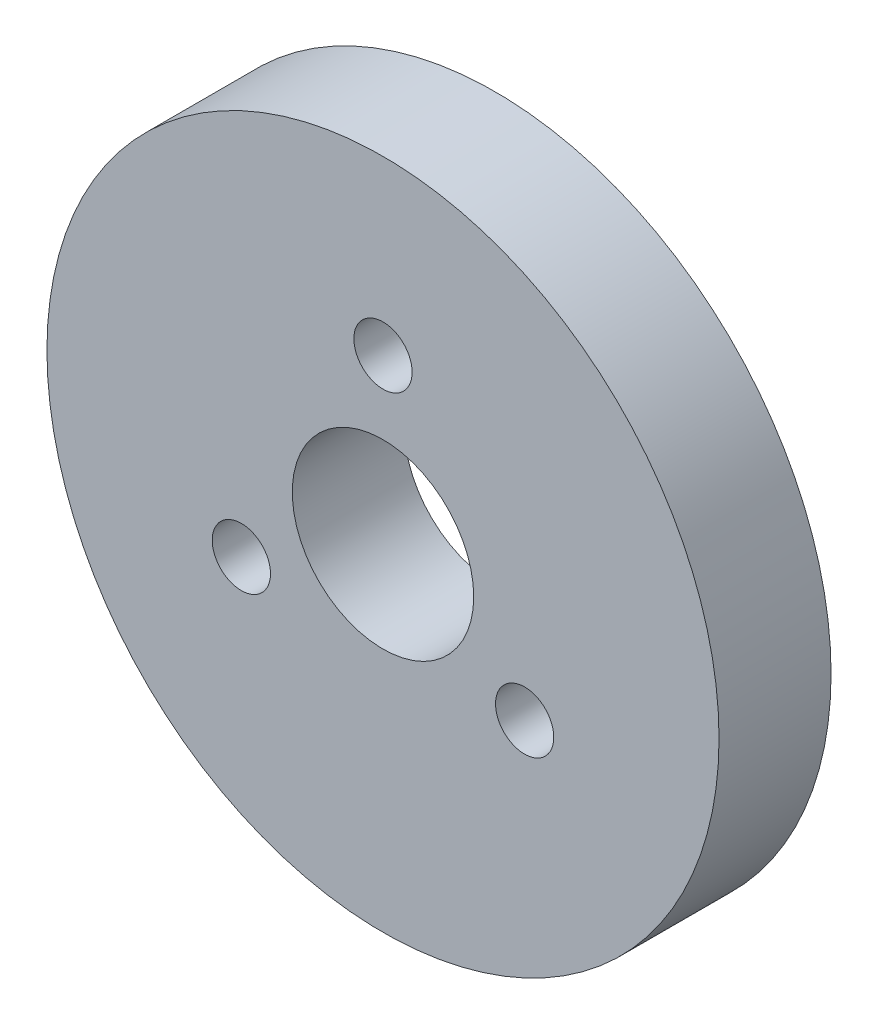
ISO-10303-21;
HEADER;
FILE_DESCRIPTION(('STEP AP214'),'2;1');
FILE_NAME('part.step','',(''),(''),'','','');
FILE_SCHEMA(('AUTOMOTIVE_DESIGN { 1 0 10303 214 1 1 1 1 }'));
ENDSEC;
DATA;
#1=APPLICATION_CONTEXT('core data for automotive mechanical design processes');
#2=APPLICATION_PROTOCOL_DEFINITION('international standard','automotive_design',2000,#1);
#3=PRODUCT_CONTEXT('',#1,'mechanical');
#4=PRODUCT('Part','Part','',(#3));
#5=PRODUCT_RELATED_PRODUCT_CATEGORY('part','',(#4));
#6=PRODUCT_DEFINITION_FORMATION('','',#4);
#7=PRODUCT_DEFINITION_CONTEXT('part definition',#1,'design');
#8=PRODUCT_DEFINITION('design','',#6,#7);
#9=PRODUCT_DEFINITION_SHAPE('','',#8);
#10=(LENGTH_UNIT() NAMED_UNIT(*) SI_UNIT(.MILLI.,.METRE.));
#11=(NAMED_UNIT(*) PLANE_ANGLE_UNIT() SI_UNIT($,.RADIAN.));
#12=(NAMED_UNIT(*) SI_UNIT($,.STERADIAN.) SOLID_ANGLE_UNIT());
#13=UNCERTAINTY_MEASURE_WITH_UNIT(LENGTH_MEASURE(1.E-05),#10,'distance_accuracy_value','');
#14=(GEOMETRIC_REPRESENTATION_CONTEXT(3) GLOBAL_UNCERTAINTY_ASSIGNED_CONTEXT((#13)) GLOBAL_UNIT_ASSIGNED_CONTEXT((#10,
#11,#12)) REPRESENTATION_CONTEXT('',''));
#15=CARTESIAN_POINT('',(0.,0.,0.));
#16=DIRECTION('',(0.,0.,1.));
#17=DIRECTION('',(1.,0.,0.));
#18=AXIS2_PLACEMENT_3D('',#15,#16,#17);
#19=CARTESIAN_POINT('',(0.,0.,5.));
#20=DIRECTION('',(0.,0.,1.));
#21=DIRECTION('',(1.,0.,0.));
#22=AXIS2_PLACEMENT_3D('',#19,#20,#21);
#23=PLANE('',#22);
#24=CARTESIAN_POINT('',(6.32198544762684,-3.64999999999975,5.));
#25=DIRECTION('',(0.,0.,1.));
#26=DIRECTION('',(1.,0.,0.));
#27=AXIS2_PLACEMENT_3D('',#24,#25,#26);
#28=CIRCLE('',#27,1.3);
#29=CARTESIAN_POINT('',(7.62198544762684,-3.64999999999975,5.));
#30=VERTEX_POINT('',#29);
#31=EDGE_CURVE('E53',#30,#30,#28,.T.);
#32=ORIENTED_EDGE('',*,*,#31,.F.);
#33=EDGE_LOOP('',(#32));
#34=FACE_BOUND('',#33,.T.);
#35=CARTESIAN_POINT('',(0.,0.,5.));
#36=DIRECTION('',(0.,0.,1.));
#37=DIRECTION('',(1.,0.,0.));
#38=AXIS2_PLACEMENT_3D('',#35,#36,#37);
#39=CIRCLE('',#38,4.05);
#40=CARTESIAN_POINT('',(4.05,0.,5.));
#41=VERTEX_POINT('',#40);
#42=EDGE_CURVE('E42',#41,#41,#39,.T.);
#43=ORIENTED_EDGE('',*,*,#42,.F.);
#44=EDGE_LOOP('',(#43));
#45=FACE_BOUND('',#44,.T.);
#46=CARTESIAN_POINT('',(0.,0.,5.));
#47=DIRECTION('',(0.,0.,1.));
#48=DIRECTION('',(1.,0.,0.));
#49=AXIS2_PLACEMENT_3D('',#46,#47,#48);
#50=CIRCLE('',#49,15.);
#51=CARTESIAN_POINT('',(15.,0.,5.));
#52=VERTEX_POINT('',#51);
#53=EDGE_CURVE('E10',#52,#52,#50,.T.);
#54=ORIENTED_EDGE('',*,*,#53,.T.);
#55=EDGE_LOOP('',(#54));
#56=FACE_BOUND('',#55,.T.);
#57=CARTESIAN_POINT('',(0.,7.3,5.));
#58=DIRECTION('',(0.,0.,1.));
#59=DIRECTION('',(1.,0.,0.));
#60=AXIS2_PLACEMENT_3D('',#57,#58,#59);
#61=CIRCLE('',#60,1.3);
#62=CARTESIAN_POINT('',(1.3,7.3,5.));
#63=VERTEX_POINT('',#62);
#64=EDGE_CURVE('E47',#63,#63,#61,.T.);
#65=ORIENTED_EDGE('',*,*,#64,.F.);
#66=EDGE_LOOP('',(#65));
#67=FACE_BOUND('',#66,.T.);
#68=CARTESIAN_POINT('',(-6.32198544762597,-3.65000000000025,5.));
#69=DIRECTION('',(0.,0.,1.));
#70=DIRECTION('',(1.,0.,0.));
#71=AXIS2_PLACEMENT_3D('',#68,#69,#70);
#72=CIRCLE('',#71,1.3);
#73=CARTESIAN_POINT('',(-5.02198544762597,-3.65000000000025,5.));
#74=VERTEX_POINT('',#73);
#75=EDGE_CURVE('E59',#74,#74,#72,.T.);
#76=ORIENTED_EDGE('',*,*,#75,.F.);
#77=EDGE_LOOP('',(#76));
#78=FACE_BOUND('',#77,.T.);
#79=ADVANCED_FACE('F31',(#34,#45,#56,#67,#78),#23,.T.);
#80=CARTESIAN_POINT('',(0.,0.,0.));
#81=DIRECTION('',(0.,0.,1.));
#82=DIRECTION('',(1.,0.,0.));
#83=AXIS2_PLACEMENT_3D('',#80,#81,#82);
#84=PLANE('',#83);
#85=CARTESIAN_POINT('',(0.,0.,0.));
#86=DIRECTION('',(0.,0.,1.));
#87=DIRECTION('',(1.,0.,0.));
#88=AXIS2_PLACEMENT_3D('',#85,#86,#87);
#89=CIRCLE('',#88,15.);
#90=CARTESIAN_POINT('',(15.,0.,0.));
#91=VERTEX_POINT('',#90);
#92=EDGE_CURVE('E35',#91,#91,#89,.T.);
#93=ORIENTED_EDGE('',*,*,#92,.F.);
#94=EDGE_LOOP('',(#93));
#95=FACE_BOUND('',#94,.T.);
#96=CARTESIAN_POINT('',(0.,0.,0.));
#97=DIRECTION('',(0.,0.,1.));
#98=DIRECTION('',(1.,0.,0.));
#99=AXIS2_PLACEMENT_3D('',#96,#97,#98);
#100=CIRCLE('',#99,4.05);
#101=CARTESIAN_POINT('',(4.05,0.,0.));
#102=VERTEX_POINT('',#101);
#103=EDGE_CURVE('E44',#102,#102,#100,.T.);
#104=ORIENTED_EDGE('',*,*,#103,.T.);
#105=EDGE_LOOP('',(#104));
#106=FACE_BOUND('',#105,.T.);
#107=CARTESIAN_POINT('',(0.,7.3,0.));
#108=DIRECTION('',(0.,0.,1.));
#109=DIRECTION('',(1.,0.,0.));
#110=AXIS2_PLACEMENT_3D('',#107,#108,#109);
#111=CIRCLE('',#110,1.3);
#112=CARTESIAN_POINT('',(1.3,7.3,0.));
#113=VERTEX_POINT('',#112);
#114=EDGE_CURVE('E50',#113,#113,#111,.T.);
#115=ORIENTED_EDGE('',*,*,#114,.T.);
#116=EDGE_LOOP('',(#115));
#117=FACE_BOUND('',#116,.T.);
#118=CARTESIAN_POINT('',(6.32198544762684,-3.64999999999975,0.));
#119=DIRECTION('',(0.,0.,1.));
#120=DIRECTION('',(1.,0.,0.));
#121=AXIS2_PLACEMENT_3D('',#118,#119,#120);
#122=CIRCLE('',#121,1.3);
#123=CARTESIAN_POINT('',(7.62198544762684,-3.64999999999975,0.));
#124=VERTEX_POINT('',#123);
#125=EDGE_CURVE('E56',#124,#124,#122,.T.);
#126=ORIENTED_EDGE('',*,*,#125,.T.);
#127=EDGE_LOOP('',(#126));
#128=FACE_BOUND('',#127,.T.);
#129=CARTESIAN_POINT('',(-6.32198544762597,-3.65000000000025,0.));
#130=DIRECTION('',(0.,0.,1.));
#131=DIRECTION('',(1.,0.,0.));
#132=AXIS2_PLACEMENT_3D('',#129,#130,#131);
#133=CIRCLE('',#132,1.3);
#134=CARTESIAN_POINT('',(-5.02198544762597,-3.65000000000025,0.));
#135=VERTEX_POINT('',#134);
#136=EDGE_CURVE('E62',#135,#135,#133,.T.);
#137=ORIENTED_EDGE('',*,*,#136,.T.);
#138=EDGE_LOOP('',(#137));
#139=FACE_BOUND('',#138,.T.);
#140=ADVANCED_FACE('F72',(#95,#106,#117,#128,#139),#84,.F.);
#141=CARTESIAN_POINT('',(0.,0.,5.));
#142=DIRECTION('',(0.,0.,-1.));
#143=DIRECTION('',(-1.,0.,0.));
#144=AXIS2_PLACEMENT_3D('',#141,#142,#143);
#145=CYLINDRICAL_SURFACE('',#144,15.);
#146=ORIENTED_EDGE('',*,*,#53,.F.);
#147=EDGE_LOOP('',(#146));
#148=FACE_BOUND('',#147,.T.);
#149=ORIENTED_EDGE('',*,*,#92,.T.);
#150=EDGE_LOOP('',(#149));
#151=FACE_BOUND('',#150,.T.);
#152=ADVANCED_FACE('F33',(#148,#151),#145,.T.);
#153=CARTESIAN_POINT('',(0.,0.,5.));
#154=DIRECTION('',(0.,0.,-1.));
#155=DIRECTION('',(-1.,0.,0.));
#156=AXIS2_PLACEMENT_3D('',#153,#154,#155);
#157=CYLINDRICAL_SURFACE('',#156,4.05);
#158=ORIENTED_EDGE('',*,*,#42,.T.);
#159=EDGE_LOOP('',(#158));
#160=FACE_BOUND('',#159,.T.);
#161=ORIENTED_EDGE('',*,*,#103,.F.);
#162=EDGE_LOOP('',(#161));
#163=FACE_BOUND('',#162,.T.);
#164=ADVANCED_FACE('F82',(#160,#163),#157,.F.);
#165=CARTESIAN_POINT('',(0.,7.3,5.));
#166=DIRECTION('',(0.,0.,-1.));
#167=DIRECTION('',(-1.,0.,0.));
#168=AXIS2_PLACEMENT_3D('',#165,#166,#167);
#169=CYLINDRICAL_SURFACE('',#168,1.3);
#170=ORIENTED_EDGE('',*,*,#64,.T.);
#171=EDGE_LOOP('',(#170));
#172=FACE_BOUND('',#171,.T.);
#173=ORIENTED_EDGE('',*,*,#114,.F.);
#174=EDGE_LOOP('',(#173));
#175=FACE_BOUND('',#174,.T.);
#176=ADVANCED_FACE('F85',(#172,#175),#169,.F.);
#177=CARTESIAN_POINT('',(6.32198544762684,-3.64999999999975,5.));
#178=DIRECTION('',(0.,0.,-1.));
#179=DIRECTION('',(-1.,0.,0.));
#180=AXIS2_PLACEMENT_3D('',#177,#178,#179);
#181=CYLINDRICAL_SURFACE('',#180,1.3);
#182=ORIENTED_EDGE('',*,*,#31,.T.);
#183=EDGE_LOOP('',(#182));
#184=FACE_BOUND('',#183,.T.);
#185=ORIENTED_EDGE('',*,*,#125,.F.);
#186=EDGE_LOOP('',(#185));
#187=FACE_BOUND('',#186,.T.);
#188=ADVANCED_FACE('F89',(#184,#187),#181,.F.);
#189=CARTESIAN_POINT('',(-6.32198544762597,-3.65000000000025,5.));
#190=DIRECTION('',(0.,0.,-1.));
#191=DIRECTION('',(-1.,0.,0.));
#192=AXIS2_PLACEMENT_3D('',#189,#190,#191);
#193=CYLINDRICAL_SURFACE('',#192,1.3);
#194=ORIENTED_EDGE('',*,*,#75,.T.);
#195=EDGE_LOOP('',(#194));
#196=FACE_BOUND('',#195,.T.);
#197=ORIENTED_EDGE('',*,*,#136,.F.);
#198=EDGE_LOOP('',(#197));
#199=FACE_BOUND('',#198,.T.);
#200=ADVANCED_FACE('F68',(#196,#199),#193,.F.);
#201=CLOSED_SHELL('',(#79,#140,#152,#164,#176,#188,#200));
#202=MANIFOLD_SOLID_BREP('B2',#201);
#203=ADVANCED_BREP_SHAPE_REPRESENTATION('',(#18,#202),#14);
#204=SHAPE_DEFINITION_REPRESENTATION(#9,#203);
ENDSEC;
END-ISO-10303-21;
